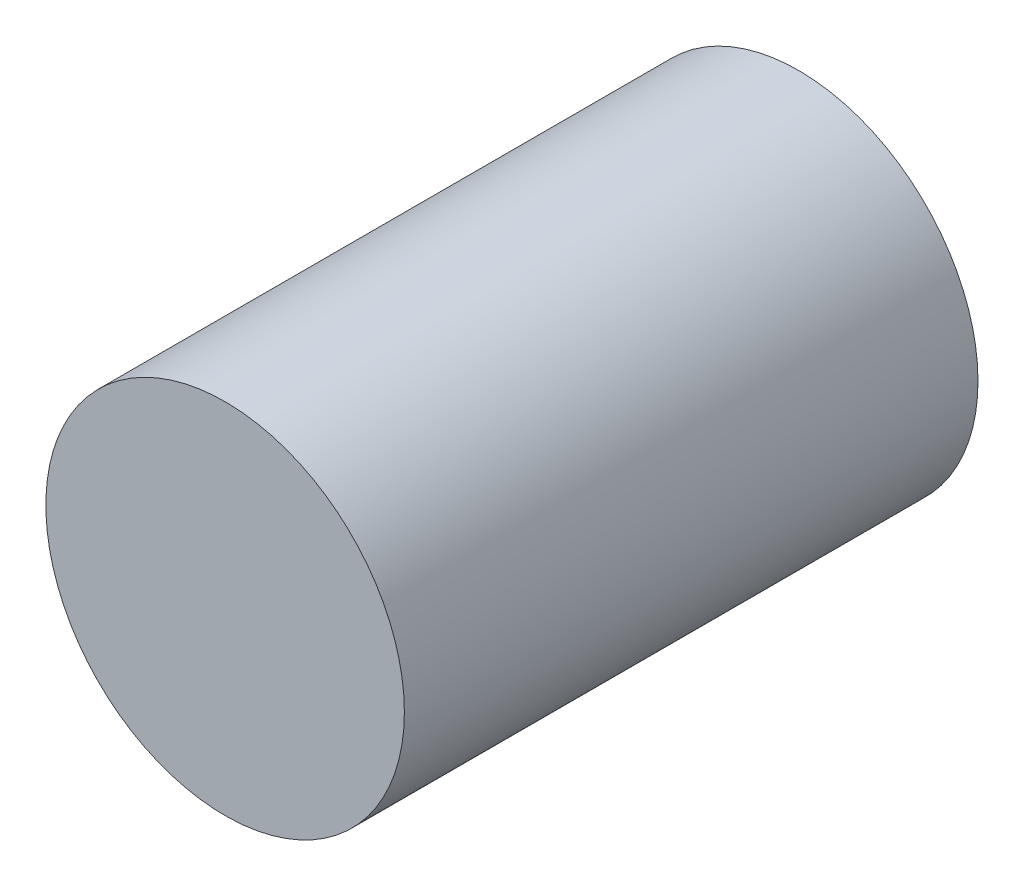
ISO-10303-21;
HEADER;
FILE_DESCRIPTION(('STEP AP214'),'2;1');
FILE_NAME('part.step','',(''),(''),'','','');
FILE_SCHEMA(('AUTOMOTIVE_DESIGN { 1 0 10303 214 1 1 1 1 }'));
ENDSEC;
DATA;
#1=APPLICATION_CONTEXT('core data for automotive mechanical design processes');
#2=APPLICATION_PROTOCOL_DEFINITION('international standard','automotive_design',2000,#1);
#3=PRODUCT_CONTEXT('',#1,'mechanical');
#4=PRODUCT('Part','Part','',(#3));
#5=PRODUCT_RELATED_PRODUCT_CATEGORY('part','',(#4));
#6=PRODUCT_DEFINITION_FORMATION('','',#4);
#7=PRODUCT_DEFINITION_CONTEXT('part definition',#1,'design');
#8=PRODUCT_DEFINITION('design','',#6,#7);
#9=PRODUCT_DEFINITION_SHAPE('','',#8);
#10=(LENGTH_UNIT() NAMED_UNIT(*) SI_UNIT(.MILLI.,.METRE.));
#11=(NAMED_UNIT(*) PLANE_ANGLE_UNIT() SI_UNIT($,.RADIAN.));
#12=(NAMED_UNIT(*) SI_UNIT($,.STERADIAN.) SOLID_ANGLE_UNIT());
#13=UNCERTAINTY_MEASURE_WITH_UNIT(LENGTH_MEASURE(1.E-05),#10,'distance_accuracy_value','');
#14=(GEOMETRIC_REPRESENTATION_CONTEXT(3) GLOBAL_UNCERTAINTY_ASSIGNED_CONTEXT((#13)) GLOBAL_UNIT_ASSIGNED_CONTEXT((#10,
#11,#12)) REPRESENTATION_CONTEXT('',''));
#15=CARTESIAN_POINT('',(0.,0.,0.));
#16=DIRECTION('',(0.,0.,1.));
#17=DIRECTION('',(1.,0.,0.));
#18=AXIS2_PLACEMENT_3D('',#15,#16,#17);
#19=CARTESIAN_POINT('',(0.,0.,40.));
#20=DIRECTION('',(0.,0.,-1.));
#21=DIRECTION('',(-1.,0.,0.));
#22=AXIS2_PLACEMENT_3D('',#19,#20,#21);
#23=CYLINDRICAL_SURFACE('',#22,12.5);
#24=CARTESIAN_POINT('',(0.,0.,40.));
#25=DIRECTION('',(0.,0.,1.));
#26=DIRECTION('',(1.,0.,0.));
#27=AXIS2_PLACEMENT_3D('',#24,#25,#26);
#28=CIRCLE('',#27,12.5);
#29=CARTESIAN_POINT('',(12.5,0.,40.));
#30=VERTEX_POINT('',#29);
#31=EDGE_CURVE('E10',#30,#30,#28,.T.);
#32=ORIENTED_EDGE('',*,*,#31,.F.);
#33=EDGE_LOOP('',(#32));
#34=FACE_BOUND('',#33,.T.);
#35=CARTESIAN_POINT('',(0.,0.,0.));
#36=DIRECTION('',(0.,0.,1.));
#37=DIRECTION('',(1.,0.,0.));
#38=AXIS2_PLACEMENT_3D('',#35,#36,#37);
#39=CIRCLE('',#38,12.5);
#40=CARTESIAN_POINT('',(12.5,0.,0.));
#41=VERTEX_POINT('',#40);
#42=EDGE_CURVE('E34',#41,#41,#39,.T.);
#43=ORIENTED_EDGE('',*,*,#42,.T.);
#44=EDGE_LOOP('',(#43));
#45=FACE_BOUND('',#44,.T.);
#46=ADVANCED_FACE('F31',(#34,#45),#23,.T.);
#47=CARTESIAN_POINT('',(0.,0.,40.));
#48=DIRECTION('',(0.,0.,1.));
#49=DIRECTION('',(1.,0.,0.));
#50=AXIS2_PLACEMENT_3D('',#47,#48,#49);
#51=PLANE('',#50);
#52=ORIENTED_EDGE('',*,*,#31,.T.);
#53=EDGE_LOOP('',(#52));
#54=FACE_BOUND('',#53,.T.);
#55=ADVANCED_FACE('F46',(#54),#51,.T.);
#56=CARTESIAN_POINT('',(0.,0.,0.));
#57=DIRECTION('',(0.,0.,1.));
#58=DIRECTION('',(1.,0.,0.));
#59=AXIS2_PLACEMENT_3D('',#56,#57,#58);
#60=PLANE('',#59);
#61=ORIENTED_EDGE('',*,*,#42,.F.);
#62=EDGE_LOOP('',(#61));
#63=FACE_BOUND('',#62,.T.);
#64=ADVANCED_FACE('F44',(#63),#60,.F.);
#65=CLOSED_SHELL('',(#46,#55,#64));
#66=MANIFOLD_SOLID_BREP('B2',#65);
#67=ADVANCED_BREP_SHAPE_REPRESENTATION('',(#18,#66),#14);
#68=SHAPE_DEFINITION_REPRESENTATION(#9,#67);
ENDSEC;
END-ISO-10303-21;
